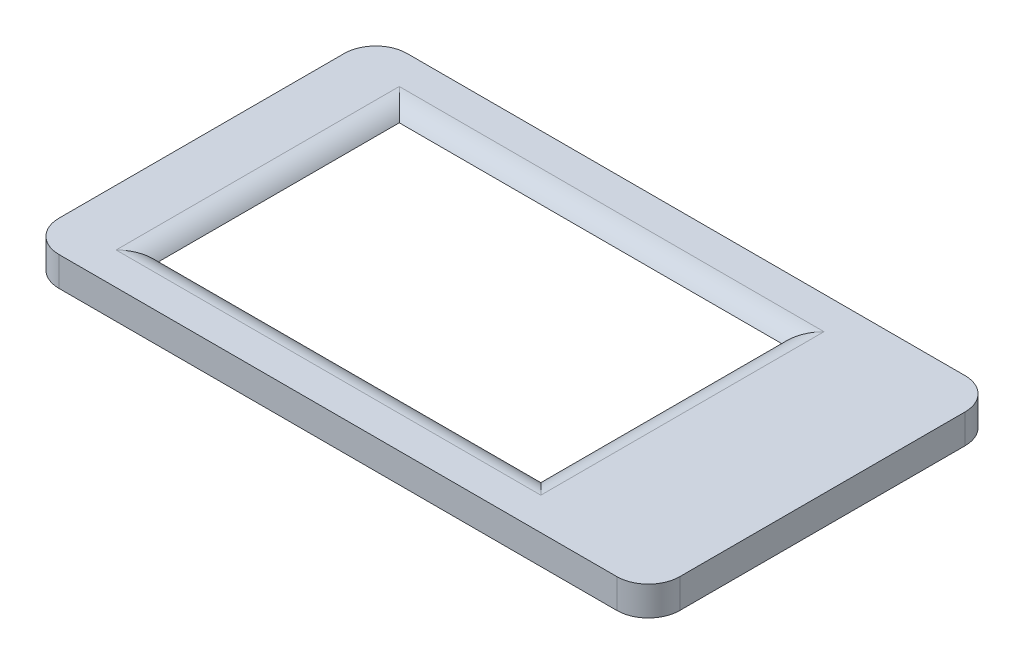
ISO-10303-21;
HEADER;
FILE_DESCRIPTION(('STEP AP214'),'2;1');
FILE_NAME('part.step','',(''),(''),'','','');
FILE_SCHEMA(('AUTOMOTIVE_DESIGN { 1 0 10303 214 1 1 1 1 }'));
ENDSEC;
DATA;
#1=APPLICATION_CONTEXT('core data for automotive mechanical design processes');
#2=APPLICATION_PROTOCOL_DEFINITION('international standard','automotive_design',2000,#1);
#3=PRODUCT_CONTEXT('',#1,'mechanical');
#4=PRODUCT('Part','Part','',(#3));
#5=PRODUCT_RELATED_PRODUCT_CATEGORY('part','',(#4));
#6=PRODUCT_DEFINITION_FORMATION('','',#4);
#7=PRODUCT_DEFINITION_CONTEXT('part definition',#1,'design');
#8=PRODUCT_DEFINITION('design','',#6,#7);
#9=PRODUCT_DEFINITION_SHAPE('','',#8);
#10=(LENGTH_UNIT() NAMED_UNIT(*) SI_UNIT(.MILLI.,.METRE.));
#11=(NAMED_UNIT(*) PLANE_ANGLE_UNIT() SI_UNIT($,.RADIAN.));
#12=(NAMED_UNIT(*) SI_UNIT($,.STERADIAN.) SOLID_ANGLE_UNIT());
#13=UNCERTAINTY_MEASURE_WITH_UNIT(LENGTH_MEASURE(1.E-05),#10,'distance_accuracy_value','');
#14=(GEOMETRIC_REPRESENTATION_CONTEXT(3) GLOBAL_UNCERTAINTY_ASSIGNED_CONTEXT((#13)) GLOBAL_UNIT_ASSIGNED_CONTEXT((#10,
#11,#12)) REPRESENTATION_CONTEXT('',''));
#15=CARTESIAN_POINT('',(0.,0.,0.));
#16=DIRECTION('',(0.,0.,1.));
#17=DIRECTION('',(1.,0.,0.));
#18=AXIS2_PLACEMENT_3D('',#15,#16,#17);
#19=CARTESIAN_POINT('',(-61.2000000000002,5.59999999999976,-33.2000000000002));
#20=DIRECTION('',(1.,0.,0.));
#21=DIRECTION('',(0.,0.,-1.));
#22=AXIS2_PLACEMENT_3D('',#19,#20,#21);
#23=PLANE('',#22);
#24=DIRECTION('',(0.,0.,1.));
#25=VECTOR('',#24,1.);
#26=CARTESIAN_POINT('',(-61.2000000000004,0.,-33.2000000000002));
#27=LINE('',#26,#25);
#28=CARTESIAN_POINT('',(-61.2000000000002,0.,-27.2000000000002));
#29=VERTEX_POINT('',#28);
#30=CARTESIAN_POINT('',(-61.2000000000001,0.,27.2));
#31=VERTEX_POINT('',#30);
#32=EDGE_CURVE('E327',#29,#31,#27,.T.);
#33=ORIENTED_EDGE('',*,*,#32,.T.);
#34=DIRECTION('',(0.,-1.00000000000001,0.));
#35=VECTOR('',#34,1.);
#36=CARTESIAN_POINT('',(-61.2000000000001,5.59999999999999,27.2));
#37=LINE('',#36,#35);
#38=CARTESIAN_POINT('',(-61.2000000000001,5.59999999999999,27.2));
#39=VERTEX_POINT('',#38);
#40=EDGE_CURVE('E212',#31,#39,#37,.F.);
#41=ORIENTED_EDGE('',*,*,#40,.T.);
#42=DIRECTION('',(0.,0.,1.));
#43=VECTOR('',#42,1.);
#44=CARTESIAN_POINT('',(-61.2000000000002,5.59999999999976,-33.2000000000002));
#45=LINE('',#44,#43);
#46=CARTESIAN_POINT('',(-61.2000000000001,5.59999999999999,-27.2000000000002));
#47=VERTEX_POINT('',#46);
#48=EDGE_CURVE('E249',#47,#39,#45,.T.);
#49=ORIENTED_EDGE('',*,*,#48,.F.);
#50=DIRECTION('',(0.,-1.00000000000001,0.));
#51=VECTOR('',#50,1.);
#52=CARTESIAN_POINT('',(-61.2000000000001,5.59999999999999,-27.2000000000002));
#53=LINE('',#52,#51);
#54=EDGE_CURVE('E209',#47,#29,#53,.T.);
#55=ORIENTED_EDGE('',*,*,#54,.T.);
#56=EDGE_LOOP('',(#33,#41,#49,#55));
#57=FACE_BOUND('',#56,.T.);
#58=ADVANCED_FACE('F48',(#57),#23,.F.);
#59=CARTESIAN_POINT('',(-61.2000000000001,5.59999999999998,33.2));
#60=DIRECTION('',(0.,0.,-1.));
#61=DIRECTION('',(-1.,0.,0.));
#62=AXIS2_PLACEMENT_3D('',#59,#60,#61);
#63=PLANE('',#62);
#64=DIRECTION('',(1.,0.,0.));
#65=VECTOR('',#64,1.);
#66=CARTESIAN_POINT('',(-61.2000000000001,5.59999999999998,33.2));
#67=LINE('',#66,#65);
#68=CARTESIAN_POINT('',(-55.2000000000001,5.59999999999977,33.2));
#69=VERTEX_POINT('',#68);
#70=CARTESIAN_POINT('',(51.2000000000002,5.59999999999977,33.2));
#71=VERTEX_POINT('',#70);
#72=EDGE_CURVE('E239',#69,#71,#67,.T.);
#73=ORIENTED_EDGE('',*,*,#72,.F.);
#74=DIRECTION('',(0.,-1.00000000000001,0.));
#75=VECTOR('',#74,1.);
#76=CARTESIAN_POINT('',(-55.2000000000001,5.59999999999977,33.2));
#77=LINE('',#76,#75);
#78=CARTESIAN_POINT('',(-55.2000000000002,0.,33.2));
#79=VERTEX_POINT('',#78);
#80=EDGE_CURVE('E197',#69,#79,#77,.T.);
#81=ORIENTED_EDGE('',*,*,#80,.T.);
#82=DIRECTION('',(1.,0.,0.));
#83=VECTOR('',#82,1.);
#84=CARTESIAN_POINT('',(-61.2000000000001,0.,33.2));
#85=LINE('',#84,#83);
#86=CARTESIAN_POINT('',(51.2000000000002,0.,33.2));
#87=VERTEX_POINT('',#86);
#88=EDGE_CURVE('E252',#79,#87,#85,.T.);
#89=ORIENTED_EDGE('',*,*,#88,.T.);
#90=DIRECTION('',(0.,-1.00000000000001,0.));
#91=VECTOR('',#90,1.);
#92=CARTESIAN_POINT('',(51.2000000000002,5.59999999999977,33.2));
#93=LINE('',#92,#91);
#94=EDGE_CURVE('E195',#87,#71,#93,.F.);
#95=ORIENTED_EDGE('',*,*,#94,.T.);
#96=EDGE_LOOP('',(#73,#81,#89,#95));
#97=FACE_BOUND('',#96,.T.);
#98=ADVANCED_FACE('F337',(#97),#63,.F.);
#99=CARTESIAN_POINT('',(57.2,5.59999999999999,-33.2));
#100=DIRECTION('',(-1.,0.,0.));
#101=DIRECTION('',(0.,0.,1.));
#102=AXIS2_PLACEMENT_3D('',#99,#100,#101);
#103=PLANE('',#102);
#104=DIRECTION('',(0.,0.,-1.));
#105=VECTOR('',#104,1.);
#106=CARTESIAN_POINT('',(57.2,5.59999999999999,-33.2));
#107=LINE('',#106,#105);
#108=CARTESIAN_POINT('',(57.2,5.59999999999977,27.2));
#109=VERTEX_POINT('',#108);
#110=CARTESIAN_POINT('',(57.2,5.59999999999977,-27.2));
#111=VERTEX_POINT('',#110);
#112=EDGE_CURVE('E229',#109,#111,#107,.T.);
#113=ORIENTED_EDGE('',*,*,#112,.F.);
#114=DIRECTION('',(0.,-1.00000000000001,0.));
#115=VECTOR('',#114,1.);
#116=CARTESIAN_POINT('',(57.2,5.59999999999977,27.2));
#117=LINE('',#116,#115);
#118=CARTESIAN_POINT('',(57.2,-2.35922392732846E-13,27.2));
#119=VERTEX_POINT('',#118);
#120=EDGE_CURVE('E13',#109,#119,#117,.T.);
#121=ORIENTED_EDGE('',*,*,#120,.T.);
#122=DIRECTION('',(0.,0.,-1.));
#123=VECTOR('',#122,1.);
#124=CARTESIAN_POINT('',(57.2,-2.35922392732846E-13,-33.2));
#125=LINE('',#124,#123);
#126=CARTESIAN_POINT('',(57.2,-2.35922392732846E-13,-27.2));
#127=VERTEX_POINT('',#126);
#128=EDGE_CURVE('E232',#119,#127,#125,.T.);
#129=ORIENTED_EDGE('',*,*,#128,.T.);
#130=DIRECTION('',(0.,-1.00000000000001,0.));
#131=VECTOR('',#130,1.);
#132=CARTESIAN_POINT('',(57.2,5.59999999999977,-27.2));
#133=LINE('',#132,#131);
#134=EDGE_CURVE('E56',#127,#111,#133,.F.);
#135=ORIENTED_EDGE('',*,*,#134,.T.);
#136=EDGE_LOOP('',(#113,#121,#129,#135));
#137=FACE_BOUND('',#136,.T.);
#138=ADVANCED_FACE('F228',(#137),#103,.F.);
#139=CARTESIAN_POINT('',(-61.2000000000002,5.59999999999976,-33.2000000000002));
#140=DIRECTION('',(0.,0.,1.));
#141=DIRECTION('',(1.,0.,0.));
#142=AXIS2_PLACEMENT_3D('',#139,#140,#141);
#143=PLANE('',#142);
#144=DIRECTION('',(-1.,0.,0.));
#145=VECTOR('',#144,1.);
#146=CARTESIAN_POINT('',(-61.2000000000004,0.,-33.2000000000002));
#147=LINE('',#146,#145);
#148=CARTESIAN_POINT('',(51.2,-2.35922392732846E-13,-33.2000000000002));
#149=VERTEX_POINT('',#148);
#150=CARTESIAN_POINT('',(-55.2000000000004,0.,-33.2000000000002));
#151=VERTEX_POINT('',#150);
#152=EDGE_CURVE('E244',#149,#151,#147,.T.);
#153=ORIENTED_EDGE('',*,*,#152,.T.);
#154=DIRECTION('',(0.,-1.00000000000001,0.));
#155=VECTOR('',#154,1.);
#156=CARTESIAN_POINT('',(-55.2000000000004,5.59999999999999,-33.2000000000005));
#157=LINE('',#156,#155);
#158=CARTESIAN_POINT('',(-55.2000000000004,5.59999999999999,-33.2000000000005));
#159=VERTEX_POINT('',#158);
#160=EDGE_CURVE('E63',#151,#159,#157,.F.);
#161=ORIENTED_EDGE('',*,*,#160,.T.);
#162=DIRECTION('',(-1.,0.,0.));
#163=VECTOR('',#162,1.);
#164=CARTESIAN_POINT('',(-61.2000000000002,5.59999999999976,-33.2000000000002));
#165=LINE('',#164,#163);
#166=CARTESIAN_POINT('',(51.2000000000002,5.59999999999999,-33.2000000000002));
#167=VERTEX_POINT('',#166);
#168=EDGE_CURVE('E238',#167,#159,#165,.T.);
#169=ORIENTED_EDGE('',*,*,#168,.F.);
#170=DIRECTION('',(0.,-1.00000000000001,0.));
#171=VECTOR('',#170,1.);
#172=CARTESIAN_POINT('',(51.2000000000002,5.59999999999999,-33.2000000000002));
#173=LINE('',#172,#171);
#174=EDGE_CURVE('E221',#167,#149,#173,.T.);
#175=ORIENTED_EDGE('',*,*,#174,.T.);
#176=EDGE_LOOP('',(#153,#161,#169,#175));
#177=FACE_BOUND('',#176,.T.);
#178=ADVANCED_FACE('F243',(#177),#143,.F.);
#179=CARTESIAN_POINT('',(0.,5.59999999999976,0.));
#180=DIRECTION('',(0.,1.00000000000001,0.));
#181=DIRECTION('',(0.,0.,1.));
#182=AXIS2_PLACEMENT_3D('',#179,#180,#181);
#183=PLANE('',#182);
#184=DIRECTION('',(-1.,0.,0.));
#185=VECTOR('',#184,1.);
#186=CARTESIAN_POINT('',(-46.5,5.59999999999976,27.));
#187=LINE('',#186,#185);
#188=CARTESIAN_POINT('',(30.5000000000001,5.59999999999999,27.));
#189=VERTEX_POINT('',#188);
#190=CARTESIAN_POINT('',(-50.5,5.59999999999999,27.));
#191=VERTEX_POINT('',#190);
#192=EDGE_CURVE('E187',#189,#191,#187,.T.);
#193=ORIENTED_EDGE('',*,*,#192,.T.);
#194=DIRECTION('',(0.,0.,-1.));
#195=VECTOR('',#194,1.);
#196=CARTESIAN_POINT('',(-50.5000000000002,5.59999999999999,-23.0000000000002));
#197=LINE('',#196,#195);
#198=CARTESIAN_POINT('',(-50.5000000000001,5.59999999999977,-27.0000000000002));
#199=VERTEX_POINT('',#198);
#200=EDGE_CURVE('E198',#191,#199,#197,.T.);
#201=ORIENTED_EDGE('',*,*,#200,.T.);
#202=DIRECTION('',(1.,0.,0.));
#203=VECTOR('',#202,1.);
#204=CARTESIAN_POINT('',(26.5000000000001,5.59999999999977,-27.0000000000002));
#205=LINE('',#204,#203);
#206=CARTESIAN_POINT('',(30.5000000000001,5.59999999999998,-27.));
#207=VERTEX_POINT('',#206);
#208=EDGE_CURVE('E258',#199,#207,#205,.T.);
#209=ORIENTED_EDGE('',*,*,#208,.T.);
#210=DIRECTION('',(0.,0.,1.));
#211=VECTOR('',#210,1.);
#212=CARTESIAN_POINT('',(30.5000000000002,5.59999999999976,23.));
#213=LINE('',#212,#211);
#214=EDGE_CURVE('E256',#207,#189,#213,.T.);
#215=ORIENTED_EDGE('',*,*,#214,.T.);
#216=EDGE_LOOP('',(#193,#201,#209,#215));
#217=FACE_BOUND('',#216,.T.);
#218=ORIENTED_EDGE('',*,*,#48,.T.);
#219=CARTESIAN_POINT('',(-55.2000000000001,5.59999999999999,27.2));
#220=DIRECTION('',(0.,1.00000000000001,0.));
#221=DIRECTION('',(0.,0.,1.));
#222=AXIS2_PLACEMENT_3D('',#219,#220,#221);
#223=CIRCLE('',#222,6.);
#224=EDGE_CURVE('E219',#39,#69,#223,.T.);
#225=ORIENTED_EDGE('',*,*,#224,.T.);
#226=ORIENTED_EDGE('',*,*,#72,.T.);
#227=CARTESIAN_POINT('',(51.2,5.59999999999999,27.2));
#228=DIRECTION('',(0.,1.00000000000001,0.));
#229=DIRECTION('',(0.,0.,1.));
#230=AXIS2_PLACEMENT_3D('',#227,#228,#229);
#231=CIRCLE('',#230,6.);
#232=EDGE_CURVE('E215',#71,#109,#231,.T.);
#233=ORIENTED_EDGE('',*,*,#232,.T.);
#234=ORIENTED_EDGE('',*,*,#112,.T.);
#235=CARTESIAN_POINT('',(51.2,5.59999999999977,-27.2));
#236=DIRECTION('',(0.,1.00000000000001,0.));
#237=DIRECTION('',(0.,0.,1.));
#238=AXIS2_PLACEMENT_3D('',#235,#236,#237);
#239=CIRCLE('',#238,6.);
#240=EDGE_CURVE('E70',#111,#167,#239,.T.);
#241=ORIENTED_EDGE('',*,*,#240,.T.);
#242=ORIENTED_EDGE('',*,*,#168,.T.);
#243=CARTESIAN_POINT('',(-55.2000000000002,5.59999999999977,-27.2000000000002));
#244=DIRECTION('',(0.,1.00000000000001,0.));
#245=DIRECTION('',(0.,0.,1.));
#246=AXIS2_PLACEMENT_3D('',#243,#244,#245);
#247=CIRCLE('',#246,6.);
#248=EDGE_CURVE('E217',#159,#47,#247,.T.);
#249=ORIENTED_EDGE('',*,*,#248,.T.);
#250=EDGE_LOOP('',(#218,#225,#226,#233,#234,#241,#242,#249));
#251=FACE_BOUND('',#250,.T.);
#252=ADVANCED_FACE('F235',(#217,#251),#183,.T.);
#253=CARTESIAN_POINT('',(0.,0.,0.));
#254=DIRECTION('',(0.,1.00000000000001,0.));
#255=DIRECTION('',(0.,0.,1.));
#256=AXIS2_PLACEMENT_3D('',#253,#254,#255);
#257=PLANE('',#256);
#258=DIRECTION('',(1.,0.,0.));
#259=VECTOR('',#258,1.);
#260=CARTESIAN_POINT('',(32.5000000000001,-2.35922392732846E-13,-29.0000000000002));
#261=LINE('',#260,#259);
#262=CARTESIAN_POINT('',(-52.5000000000002,0.,-29.));
#263=VERTEX_POINT('',#262);
#264=CARTESIAN_POINT('',(32.5000000000001,-2.35922392732846E-13,-29.0000000000002));
#265=VERTEX_POINT('',#264);
#266=EDGE_CURVE('E289',#263,#265,#261,.T.);
#267=ORIENTED_EDGE('',*,*,#266,.F.);
#268=DIRECTION('',(0.,0.,-1.));
#269=VECTOR('',#268,1.);
#270=CARTESIAN_POINT('',(-52.5000000000002,0.,-29.));
#271=LINE('',#270,#269);
#272=CARTESIAN_POINT('',(-52.5000000000002,0.,29.));
#273=VERTEX_POINT('',#272);
#274=EDGE_CURVE('E273',#273,#263,#271,.T.);
#275=ORIENTED_EDGE('',*,*,#274,.F.);
#276=DIRECTION('',(-1.,0.,0.));
#277=VECTOR('',#276,1.);
#278=CARTESIAN_POINT('',(32.5,-2.35922392732846E-13,29.));
#279=LINE('',#278,#277);
#280=CARTESIAN_POINT('',(32.5,-2.35922392732846E-13,29.));
#281=VERTEX_POINT('',#280);
#282=EDGE_CURVE('E278',#281,#273,#279,.T.);
#283=ORIENTED_EDGE('',*,*,#282,.F.);
#284=DIRECTION('',(0.,0.,1.));
#285=VECTOR('',#284,1.);
#286=CARTESIAN_POINT('',(32.5000000000001,-2.35922392732846E-13,-29.0000000000002));
#287=LINE('',#286,#285);
#288=EDGE_CURVE('E292',#265,#281,#287,.T.);
#289=ORIENTED_EDGE('',*,*,#288,.F.);
#290=EDGE_LOOP('',(#267,#275,#283,#289));
#291=FACE_BOUND('',#290,.T.);
#292=CARTESIAN_POINT('',(35.9600000000001,-2.35922392732846E-13,-18.7000000000002));
#293=DIRECTION('',(0.,-1.00000000000001,0.));
#294=DIRECTION('',(0.,0.,1.));
#295=AXIS2_PLACEMENT_3D('',#292,#293,#294);
#296=CIRCLE('',#295,3.);
#297=CARTESIAN_POINT('',(35.9600000000001,-2.35922423136696E-13,-15.7000000000002));
#298=VERTEX_POINT('',#297);
#299=EDGE_CURVE('E299',#298,#298,#296,.T.);
#300=ORIENTED_EDGE('',*,*,#299,.F.);
#301=EDGE_LOOP('',(#300));
#302=FACE_BOUND('',#301,.T.);
#303=CARTESIAN_POINT('',(35.9600000000002,-4.71844785465692E-13,22.3));
#304=DIRECTION('',(0.,-1.00000000000001,0.));
#305=DIRECTION('',(0.,0.,-1.));
#306=AXIS2_PLACEMENT_3D('',#303,#304,#305);
#307=CIRCLE('',#306,3.);
#308=CARTESIAN_POINT('',(35.9600000000002,-4.71844755061841E-13,19.3));
#309=VERTEX_POINT('',#308);
#310=EDGE_CURVE('E309',#309,#309,#307,.T.);
#311=ORIENTED_EDGE('',*,*,#310,.F.);
#312=EDGE_LOOP('',(#311));
#313=FACE_BOUND('',#312,.T.);
#314=CARTESIAN_POINT('',(-56.16,0.,-21.9));
#315=DIRECTION('',(0.,-1.00000000000001,0.));
#316=DIRECTION('',(0.,0.,1.));
#317=AXIS2_PLACEMENT_3D('',#314,#315,#316);
#318=CIRCLE('',#317,3.);
#319=CARTESIAN_POINT('',(-56.16,0.,-18.9));
#320=VERTEX_POINT('',#319);
#321=EDGE_CURVE('E315',#320,#320,#318,.T.);
#322=ORIENTED_EDGE('',*,*,#321,.F.);
#323=EDGE_LOOP('',(#322));
#324=FACE_BOUND('',#323,.T.);
#325=CARTESIAN_POINT('',(-56.1600000000001,0.,21.1));
#326=DIRECTION('',(0.,-1.00000000000001,0.));
#327=DIRECTION('',(0.,0.,-1.));
#328=AXIS2_PLACEMENT_3D('',#325,#326,#327);
#329=CIRCLE('',#328,3.);
#330=CARTESIAN_POINT('',(-56.1600000000001,0.,18.1));
#331=VERTEX_POINT('',#330);
#332=EDGE_CURVE('E321',#331,#331,#329,.T.);
#333=ORIENTED_EDGE('',*,*,#332,.F.);
#334=EDGE_LOOP('',(#333));
#335=FACE_BOUND('',#334,.T.);
#336=ORIENTED_EDGE('',*,*,#88,.F.);
#337=CARTESIAN_POINT('',(-55.2000000000002,-2.35922392732846E-13,27.2));
#338=DIRECTION('',(0.,1.00000000000001,0.));
#339=DIRECTION('',(0.,0.,1.));
#340=AXIS2_PLACEMENT_3D('',#337,#338,#339);
#341=CIRCLE('',#340,6.);
#342=EDGE_CURVE('E207',#79,#31,#341,.F.);
#343=ORIENTED_EDGE('',*,*,#342,.T.);
#344=ORIENTED_EDGE('',*,*,#32,.F.);
#345=CARTESIAN_POINT('',(-55.2000000000002,0.,-27.2000000000002));
#346=DIRECTION('',(0.,1.00000000000001,0.));
#347=DIRECTION('',(0.,0.,1.));
#348=AXIS2_PLACEMENT_3D('',#345,#346,#347);
#349=CIRCLE('',#348,6.);
#350=EDGE_CURVE('E205',#29,#151,#349,.F.);
#351=ORIENTED_EDGE('',*,*,#350,.T.);
#352=ORIENTED_EDGE('',*,*,#152,.F.);
#353=CARTESIAN_POINT('',(51.2,-2.35922392732846E-13,-27.2000000000002));
#354=DIRECTION('',(0.,1.00000000000001,0.));
#355=DIRECTION('',(0.,0.,1.));
#356=AXIS2_PLACEMENT_3D('',#353,#354,#355);
#357=CIRCLE('',#356,6.);
#358=EDGE_CURVE('E201',#149,#127,#357,.F.);
#359=ORIENTED_EDGE('',*,*,#358,.T.);
#360=ORIENTED_EDGE('',*,*,#128,.F.);
#361=CARTESIAN_POINT('',(51.2,-2.35922392732846E-13,27.2000000000005));
#362=DIRECTION('',(0.,1.00000000000001,0.));
#363=DIRECTION('',(0.,0.,1.));
#364=AXIS2_PLACEMENT_3D('',#361,#362,#363);
#365=CIRCLE('',#364,6.);
#366=EDGE_CURVE('E203',#119,#87,#365,.F.);
#367=ORIENTED_EDGE('',*,*,#366,.T.);
#368=EDGE_LOOP('',(#336,#343,#344,#351,#352,#359,#360,#367));
#369=FACE_BOUND('',#368,.T.);
#370=ADVANCED_FACE('F247',(#291,#302,#313,#324,#335,#369),#257,.F.);
#371=CARTESIAN_POINT('',(-56.1600000000001,2.99999999999999,21.1));
#372=DIRECTION('',(0.,-1.00000000000001,0.));
#373=DIRECTION('',(0.,0.,-1.));
#374=AXIS2_PLACEMENT_3D('',#371,#372,#373);
#375=CYLINDRICAL_SURFACE('',#374,3.);
#376=CARTESIAN_POINT('',(-56.1600000000001,2.99999999999999,21.1));
#377=DIRECTION('',(0.,-1.00000000000001,0.));
#378=DIRECTION('',(0.,0.,-1.));
#379=AXIS2_PLACEMENT_3D('',#376,#377,#378);
#380=CIRCLE('',#379,3.);
#381=CARTESIAN_POINT('',(-56.1600000000001,2.99999999999999,18.1));
#382=VERTEX_POINT('',#381);
#383=EDGE_CURVE('E324',#382,#382,#380,.T.);
#384=ORIENTED_EDGE('',*,*,#383,.F.);
#385=EDGE_LOOP('',(#384));
#386=FACE_BOUND('',#385,.T.);
#387=ORIENTED_EDGE('',*,*,#332,.T.);
#388=EDGE_LOOP('',(#387));
#389=FACE_BOUND('',#388,.T.);
#390=ADVANCED_FACE('F495',(#386,#389),#375,.F.);
#391=CARTESIAN_POINT('',(-56.1600000000001,2.99999999999999,21.1));
#392=DIRECTION('',(0.,-1.00000000000001,0.));
#393=DIRECTION('',(0.,0.,-1.));
#394=AXIS2_PLACEMENT_3D('',#391,#392,#393);
#395=PLANE('',#394);
#396=ORIENTED_EDGE('',*,*,#383,.T.);
#397=EDGE_LOOP('',(#396));
#398=FACE_BOUND('',#397,.T.);
#399=ADVANCED_FACE('F487',(#398),#395,.T.);
#400=CARTESIAN_POINT('',(-56.1600000000001,2.99999999999977,-21.9000000000002));
#401=DIRECTION('',(0.,-1.00000000000001,0.));
#402=DIRECTION('',(0.,0.,-1.));
#403=AXIS2_PLACEMENT_3D('',#400,#401,#402);
#404=CYLINDRICAL_SURFACE('',#403,3.);
#405=CARTESIAN_POINT('',(-56.1600000000001,2.99999999999977,-21.9000000000002));
#406=DIRECTION('',(0.,-1.00000000000001,0.));
#407=DIRECTION('',(0.,0.,1.));
#408=AXIS2_PLACEMENT_3D('',#405,#406,#407);
#409=CIRCLE('',#408,3.);
#410=CARTESIAN_POINT('',(-56.1600000000001,2.99999999999977,-18.9000000000002));
#411=VERTEX_POINT('',#410);
#412=EDGE_CURVE('E318',#411,#411,#409,.T.);
#413=ORIENTED_EDGE('',*,*,#412,.F.);
#414=EDGE_LOOP('',(#413));
#415=FACE_BOUND('',#414,.T.);
#416=ORIENTED_EDGE('',*,*,#321,.T.);
#417=EDGE_LOOP('',(#416));
#418=FACE_BOUND('',#417,.T.);
#419=ADVANCED_FACE('F479',(#415,#418),#404,.F.);
#420=CARTESIAN_POINT('',(-56.1600000000001,2.99999999999977,-21.9000000000002));
#421=DIRECTION('',(0.,1.00000000000001,0.));
#422=DIRECTION('',(0.,0.,1.));
#423=AXIS2_PLACEMENT_3D('',#420,#421,#422);
#424=PLANE('',#423);
#425=ORIENTED_EDGE('',*,*,#412,.T.);
#426=EDGE_LOOP('',(#425));
#427=FACE_BOUND('',#426,.T.);
#428=ADVANCED_FACE('F471',(#427),#424,.F.);
#429=CARTESIAN_POINT('',(35.9600000000001,2.99999999999977,22.3));
#430=DIRECTION('',(0.,-1.00000000000001,0.));
#431=DIRECTION('',(0.,0.,-1.));
#432=AXIS2_PLACEMENT_3D('',#429,#430,#431);
#433=CYLINDRICAL_SURFACE('',#432,3.);
#434=CARTESIAN_POINT('',(35.9600000000001,2.99999999999977,22.3));
#435=DIRECTION('',(0.,-1.00000000000001,0.));
#436=DIRECTION('',(0.,0.,-1.));
#437=AXIS2_PLACEMENT_3D('',#434,#435,#436);
#438=CIRCLE('',#437,3.);
#439=CARTESIAN_POINT('',(35.9600000000001,2.99999999999977,19.3));
#440=VERTEX_POINT('',#439);
#441=EDGE_CURVE('E312',#440,#440,#438,.T.);
#442=ORIENTED_EDGE('',*,*,#441,.F.);
#443=EDGE_LOOP('',(#442));
#444=FACE_BOUND('',#443,.T.);
#445=ORIENTED_EDGE('',*,*,#310,.T.);
#446=EDGE_LOOP('',(#445));
#447=FACE_BOUND('',#446,.T.);
#448=ADVANCED_FACE('F463',(#444,#447),#433,.F.);
#449=CARTESIAN_POINT('',(35.9600000000001,2.99999999999977,22.3));
#450=DIRECTION('',(0.,-1.00000000000001,0.));
#451=DIRECTION('',(0.,0.,-1.));
#452=AXIS2_PLACEMENT_3D('',#449,#450,#451);
#453=PLANE('',#452);
#454=ORIENTED_EDGE('',*,*,#441,.T.);
#455=EDGE_LOOP('',(#454));
#456=FACE_BOUND('',#455,.T.);
#457=ADVANCED_FACE('F455',(#456),#453,.T.);
#458=CARTESIAN_POINT('',(35.9600000000001,2.99999999999977,-18.7));
#459=DIRECTION('',(0.,-1.00000000000001,0.));
#460=DIRECTION('',(0.,0.,-1.));
#461=AXIS2_PLACEMENT_3D('',#458,#459,#460);
#462=CYLINDRICAL_SURFACE('',#461,3.);
#463=CARTESIAN_POINT('',(35.9600000000001,2.99999999999977,-18.7));
#464=DIRECTION('',(0.,-1.00000000000001,0.));
#465=DIRECTION('',(0.,0.,1.));
#466=AXIS2_PLACEMENT_3D('',#463,#464,#465);
#467=CIRCLE('',#466,3.);
#468=CARTESIAN_POINT('',(35.9600000000001,2.99999999999977,-15.7));
#469=VERTEX_POINT('',#468);
#470=EDGE_CURVE('E306',#469,#469,#467,.T.);
#471=ORIENTED_EDGE('',*,*,#470,.F.);
#472=EDGE_LOOP('',(#471));
#473=FACE_BOUND('',#472,.T.);
#474=ORIENTED_EDGE('',*,*,#299,.T.);
#475=EDGE_LOOP('',(#474));
#476=FACE_BOUND('',#475,.T.);
#477=ADVANCED_FACE('F447',(#473,#476),#462,.F.);
#478=CARTESIAN_POINT('',(35.9600000000001,2.99999999999977,-18.7));
#479=DIRECTION('',(0.,1.00000000000001,0.));
#480=DIRECTION('',(0.,0.,1.));
#481=AXIS2_PLACEMENT_3D('',#478,#479,#480);
#482=PLANE('',#481);
#483=ORIENTED_EDGE('',*,*,#470,.T.);
#484=EDGE_LOOP('',(#483));
#485=FACE_BOUND('',#484,.T.);
#486=ADVANCED_FACE('F439',(#485),#482,.F.);
#487=CARTESIAN_POINT('',(-52.5000000000002,3.60000000000001,-29.0000000000002));
#488=DIRECTION('',(-1.,0.,0.));
#489=DIRECTION('',(0.,0.,1.));
#490=AXIS2_PLACEMENT_3D('',#487,#488,#489);
#491=PLANE('',#490);
#492=ORIENTED_EDGE('',*,*,#274,.T.);
#493=DIRECTION('',(0.,-1.00000000000001,0.));
#494=VECTOR('',#493,1.);
#495=CARTESIAN_POINT('',(-52.5000000000002,3.60000000000001,-29.0000000000002));
#496=LINE('',#495,#494);
#497=CARTESIAN_POINT('',(-52.5000000000002,3.60000000000001,-29.0000000000002));
#498=VERTEX_POINT('',#497);
#499=EDGE_CURVE('E287',#498,#263,#496,.T.);
#500=ORIENTED_EDGE('',*,*,#499,.F.);
#501=DIRECTION('',(0.,0.,-1.));
#502=VECTOR('',#501,1.);
#503=CARTESIAN_POINT('',(-52.5000000000002,3.60000000000001,-29.0000000000002));
#504=LINE('',#503,#502);
#505=CARTESIAN_POINT('',(-52.5000000000002,3.59999999999999,29.));
#506=VERTEX_POINT('',#505);
#507=EDGE_CURVE('E274',#506,#498,#504,.T.);
#508=ORIENTED_EDGE('',*,*,#507,.F.);
#509=DIRECTION('',(0.,-1.00000000000001,0.));
#510=VECTOR('',#509,1.);
#511=CARTESIAN_POINT('',(-52.5000000000002,3.59999999999999,29.));
#512=LINE('',#511,#510);
#513=EDGE_CURVE('E297',#506,#273,#512,.T.);
#514=ORIENTED_EDGE('',*,*,#513,.T.);
#515=EDGE_LOOP('',(#492,#500,#508,#514));
#516=FACE_BOUND('',#515,.T.);
#517=ADVANCED_FACE('F431',(#516),#491,.F.);
#518=CARTESIAN_POINT('',(32.5000000000001,3.59999999999999,29.));
#519=DIRECTION('',(0.,0.,1.));
#520=DIRECTION('',(1.,0.,0.));
#521=AXIS2_PLACEMENT_3D('',#518,#519,#520);
#522=PLANE('',#521);
#523=ORIENTED_EDGE('',*,*,#282,.T.);
#524=ORIENTED_EDGE('',*,*,#513,.F.);
#525=DIRECTION('',(-1.,0.,0.));
#526=VECTOR('',#525,1.);
#527=CARTESIAN_POINT('',(32.5000000000001,3.59999999999999,29.));
#528=LINE('',#527,#526);
#529=CARTESIAN_POINT('',(32.5000000000001,3.59999999999999,29.));
#530=VERTEX_POINT('',#529);
#531=EDGE_CURVE('E284',#530,#506,#528,.T.);
#532=ORIENTED_EDGE('',*,*,#531,.F.);
#533=DIRECTION('',(0.,-1.00000000000001,0.));
#534=VECTOR('',#533,1.);
#535=CARTESIAN_POINT('',(32.5000000000001,3.59999999999999,29.));
#536=LINE('',#535,#534);
#537=EDGE_CURVE('E300',#530,#281,#536,.T.);
#538=ORIENTED_EDGE('',*,*,#537,.T.);
#539=EDGE_LOOP('',(#523,#524,#532,#538));
#540=FACE_BOUND('',#539,.T.);
#541=ADVANCED_FACE('F423',(#540),#522,.F.);
#542=CARTESIAN_POINT('',(32.5000000000002,3.60000000000001,-29.));
#543=DIRECTION('',(1.,0.,0.));
#544=DIRECTION('',(0.,0.,-1.));
#545=AXIS2_PLACEMENT_3D('',#542,#543,#544);
#546=PLANE('',#545);
#547=ORIENTED_EDGE('',*,*,#288,.T.);
#548=ORIENTED_EDGE('',*,*,#537,.F.);
#549=DIRECTION('',(0.,0.,1.));
#550=VECTOR('',#549,1.);
#551=CARTESIAN_POINT('',(32.5000000000002,3.60000000000001,-29.));
#552=LINE('',#551,#550);
#553=CARTESIAN_POINT('',(32.5000000000002,3.60000000000001,-29.));
#554=VERTEX_POINT('',#553);
#555=EDGE_CURVE('E281',#554,#530,#552,.T.);
#556=ORIENTED_EDGE('',*,*,#555,.F.);
#557=DIRECTION('',(0.,-1.00000000000001,0.));
#558=VECTOR('',#557,1.);
#559=CARTESIAN_POINT('',(32.5000000000002,3.60000000000001,-29.));
#560=LINE('',#559,#558);
#561=EDGE_CURVE('E302',#554,#265,#560,.T.);
#562=ORIENTED_EDGE('',*,*,#561,.T.);
#563=EDGE_LOOP('',(#547,#548,#556,#562));
#564=FACE_BOUND('',#563,.T.);
#565=ADVANCED_FACE('F415',(#564),#546,.F.);
#566=CARTESIAN_POINT('',(32.5000000000002,3.60000000000001,-29.));
#567=DIRECTION('',(0.,0.,-1.));
#568=DIRECTION('',(-1.,0.,0.));
#569=AXIS2_PLACEMENT_3D('',#566,#567,#568);
#570=PLANE('',#569);
#571=ORIENTED_EDGE('',*,*,#266,.T.);
#572=ORIENTED_EDGE('',*,*,#561,.F.);
#573=DIRECTION('',(1.,0.,0.));
#574=VECTOR('',#573,1.);
#575=CARTESIAN_POINT('',(32.5000000000002,3.60000000000001,-29.));
#576=LINE('',#575,#574);
#577=EDGE_CURVE('E277',#498,#554,#576,.T.);
#578=ORIENTED_EDGE('',*,*,#577,.F.);
#579=ORIENTED_EDGE('',*,*,#499,.T.);
#580=EDGE_LOOP('',(#571,#572,#578,#579));
#581=FACE_BOUND('',#580,.T.);
#582=ADVANCED_FACE('F408',(#581),#570,.F.);
#583=CARTESIAN_POINT('',(0.,3.59999999999977,0.));
#584=DIRECTION('',(0.,-1.00000000000001,0.));
#585=DIRECTION('',(0.,0.,-1.));
#586=AXIS2_PLACEMENT_3D('',#583,#584,#585);
#587=PLANE('',#586);
#588=DIRECTION('',(1.,0.,0.));
#589=VECTOR('',#588,1.);
#590=CARTESIAN_POINT('',(-46.5000000000002,3.59999999999977,-23.));
#591=LINE('',#590,#589);
#592=CARTESIAN_POINT('',(-46.5000000000002,3.59999999999977,-23.));
#593=VERTEX_POINT('',#592);
#594=CARTESIAN_POINT('',(26.5,3.59999999999977,-23.0000000000002));
#595=VERTEX_POINT('',#594);
#596=EDGE_CURVE('E184',#593,#595,#591,.T.);
#597=ORIENTED_EDGE('',*,*,#596,.F.);
#598=DIRECTION('',(0.,0.,-1.));
#599=VECTOR('',#598,1.);
#600=CARTESIAN_POINT('',(-46.5,3.59999999999999,23.));
#601=LINE('',#600,#599);
#602=CARTESIAN_POINT('',(-46.5,3.59999999999999,23.));
#603=VERTEX_POINT('',#602);
#604=EDGE_CURVE('E170',#603,#593,#601,.T.);
#605=ORIENTED_EDGE('',*,*,#604,.F.);
#606=DIRECTION('',(-1.,0.,0.));
#607=VECTOR('',#606,1.);
#608=CARTESIAN_POINT('',(-46.5,3.59999999999999,23.));
#609=LINE('',#608,#607);
#610=CARTESIAN_POINT('',(26.5,3.59999999999977,23.));
#611=VERTEX_POINT('',#610);
#612=EDGE_CURVE('E163',#611,#603,#609,.T.);
#613=ORIENTED_EDGE('',*,*,#612,.F.);
#614=DIRECTION('',(0.,0.,1.));
#615=VECTOR('',#614,1.);
#616=CARTESIAN_POINT('',(26.5,3.59999999999977,23.));
#617=LINE('',#616,#615);
#618=EDGE_CURVE('E167',#595,#611,#617,.T.);
#619=ORIENTED_EDGE('',*,*,#618,.F.);
#620=EDGE_LOOP('',(#597,#605,#613,#619));
#621=FACE_BOUND('',#620,.T.);
#622=ORIENTED_EDGE('',*,*,#507,.T.);
#623=ORIENTED_EDGE('',*,*,#577,.T.);
#624=ORIENTED_EDGE('',*,*,#555,.T.);
#625=ORIENTED_EDGE('',*,*,#531,.T.);
#626=EDGE_LOOP('',(#622,#623,#624,#625));
#627=FACE_BOUND('',#626,.T.);
#628=ADVANCED_FACE('F165',(#621,#627),#587,.T.);
#629=CARTESIAN_POINT('',(30.5000000000002,0.600000000000003,23.));
#630=DIRECTION('',(0.,0.,-1.));
#631=DIRECTION('',(-1.,0.,0.));
#632=AXIS2_PLACEMENT_3D('',#629,#630,#631);
#633=CYLINDRICAL_SURFACE('',#632,5.);
#634=CARTESIAN_POINT('',(30.5000000000002,0.600000000000003,27.));
#635=DIRECTION('',(0.707106781186549,0.,-0.707106781186549));
#636=DIRECTION('',(0.707106781186549,0.,0.707106781186549));
#637=AXIS2_PLACEMENT_3D('',#634,#635,#636);
#638=ELLIPSE('',#637,7.07106781186547,5.);
#639=EDGE_CURVE('E179',#189,#611,#638,.F.);
#640=ORIENTED_EDGE('',*,*,#639,.F.);
#641=ORIENTED_EDGE('',*,*,#214,.F.);
#642=CARTESIAN_POINT('',(30.5000000000001,0.599999999999767,-27.));
#643=DIRECTION('',(-0.707106781186549,0.,-0.707106781186549));
#644=DIRECTION('',(-0.707106781186549,0.,0.707106781186549));
#645=AXIS2_PLACEMENT_3D('',#642,#643,#644);
#646=ELLIPSE('',#645,7.07106781186547,5.);
#647=EDGE_CURVE('E182',#595,#207,#646,.T.);
#648=ORIENTED_EDGE('',*,*,#647,.F.);
#649=ORIENTED_EDGE('',*,*,#618,.T.);
#650=EDGE_LOOP('',(#640,#641,#648,#649));
#651=FACE_BOUND('',#650,.T.);
#652=ADVANCED_FACE('F177',(#651),#633,.T.);
#653=CARTESIAN_POINT('',(-46.5000000000002,0.599999999999989,-27.));
#654=DIRECTION('',(-1.,0.,0.));
#655=DIRECTION('',(0.,0.,1.));
#656=AXIS2_PLACEMENT_3D('',#653,#654,#655);
#657=CYLINDRICAL_SURFACE('',#656,5.);
#658=ORIENTED_EDGE('',*,*,#647,.T.);
#659=ORIENTED_EDGE('',*,*,#208,.F.);
#660=CARTESIAN_POINT('',(-50.5000000000002,0.599999999999767,-27.0000000000002));
#661=DIRECTION('',(-0.707106781186549,0.,0.707106781186549));
#662=DIRECTION('',(0.707106781186549,0.,0.707106781186549));
#663=AXIS2_PLACEMENT_3D('',#660,#661,#662);
#664=ELLIPSE('',#663,7.07106781186547,5.);
#665=EDGE_CURVE('E188',#593,#199,#664,.T.);
#666=ORIENTED_EDGE('',*,*,#665,.F.);
#667=ORIENTED_EDGE('',*,*,#596,.T.);
#668=EDGE_LOOP('',(#658,#659,#666,#667));
#669=FACE_BOUND('',#668,.T.);
#670=ADVANCED_FACE('F269',(#669),#657,.T.);
#671=CARTESIAN_POINT('',(-46.5000000000001,0.599999999999767,27.));
#672=DIRECTION('',(1.,0.,0.));
#673=DIRECTION('',(0.,0.,-1.));
#674=AXIS2_PLACEMENT_3D('',#671,#672,#673);
#675=CYLINDRICAL_SURFACE('',#674,5.);
#676=ORIENTED_EDGE('',*,*,#639,.T.);
#677=ORIENTED_EDGE('',*,*,#612,.T.);
#678=CARTESIAN_POINT('',(-50.5000000000001,0.599999999999989,27.));
#679=DIRECTION('',(0.707106781186549,0.,0.707106781186549));
#680=DIRECTION('',(-0.707106781186549,0.,0.707106781186549));
#681=AXIS2_PLACEMENT_3D('',#678,#679,#680);
#682=ELLIPSE('',#681,7.07106781186547,5.);
#683=EDGE_CURVE('E191',#191,#603,#682,.F.);
#684=ORIENTED_EDGE('',*,*,#683,.F.);
#685=ORIENTED_EDGE('',*,*,#192,.F.);
#686=EDGE_LOOP('',(#676,#677,#684,#685));
#687=FACE_BOUND('',#686,.T.);
#688=ADVANCED_FACE('F186',(#687),#675,.T.);
#689=CARTESIAN_POINT('',(-50.5000000000002,0.599999999999989,23.));
#690=DIRECTION('',(0.,0.,1.));
#691=DIRECTION('',(1.,0.,0.));
#692=AXIS2_PLACEMENT_3D('',#689,#690,#691);
#693=CYLINDRICAL_SURFACE('',#692,5.);
#694=ORIENTED_EDGE('',*,*,#665,.T.);
#695=ORIENTED_EDGE('',*,*,#200,.F.);
#696=ORIENTED_EDGE('',*,*,#683,.T.);
#697=ORIENTED_EDGE('',*,*,#604,.T.);
#698=EDGE_LOOP('',(#694,#695,#696,#697));
#699=FACE_BOUND('',#698,.T.);
#700=ADVANCED_FACE('F264',(#699),#693,.T.);
#701=CARTESIAN_POINT('',(-55.2000000000001,5.59999999999999,27.2));
#702=DIRECTION('',(0.,-1.00000000000001,0.));
#703=DIRECTION('',(0.,0.,-1.));
#704=AXIS2_PLACEMENT_3D('',#701,#702,#703);
#705=CYLINDRICAL_SURFACE('',#704,6.);
#706=ORIENTED_EDGE('',*,*,#224,.F.);
#707=ORIENTED_EDGE('',*,*,#40,.F.);
#708=ORIENTED_EDGE('',*,*,#342,.F.);
#709=ORIENTED_EDGE('',*,*,#80,.F.);
#710=EDGE_LOOP('',(#706,#707,#708,#709));
#711=FACE_BOUND('',#710,.T.);
#712=ADVANCED_FACE('F347',(#711),#705,.T.);
#713=CARTESIAN_POINT('',(-55.2000000000002,5.59999999999977,-27.2000000000002));
#714=DIRECTION('',(0.,-1.00000000000001,0.));
#715=DIRECTION('',(0.,0.,-1.));
#716=AXIS2_PLACEMENT_3D('',#713,#714,#715);
#717=CYLINDRICAL_SURFACE('',#716,6.);
#718=ORIENTED_EDGE('',*,*,#248,.F.);
#719=ORIENTED_EDGE('',*,*,#160,.F.);
#720=ORIENTED_EDGE('',*,*,#350,.F.);
#721=ORIENTED_EDGE('',*,*,#54,.F.);
#722=EDGE_LOOP('',(#718,#719,#720,#721));
#723=FACE_BOUND('',#722,.T.);
#724=ADVANCED_FACE('F342',(#723),#717,.T.);
#725=CARTESIAN_POINT('',(51.2,5.59999999999999,27.2));
#726=DIRECTION('',(0.,-1.00000000000001,0.));
#727=DIRECTION('',(0.,0.,-1.));
#728=AXIS2_PLACEMENT_3D('',#725,#726,#727);
#729=CYLINDRICAL_SURFACE('',#728,6.);
#730=ORIENTED_EDGE('',*,*,#232,.F.);
#731=ORIENTED_EDGE('',*,*,#94,.F.);
#732=ORIENTED_EDGE('',*,*,#366,.F.);
#733=ORIENTED_EDGE('',*,*,#120,.F.);
#734=EDGE_LOOP('',(#730,#731,#732,#733));
#735=FACE_BOUND('',#734,.T.);
#736=ADVANCED_FACE('F340',(#735),#729,.T.);
#737=CARTESIAN_POINT('',(51.2,5.59999999999977,-27.2));
#738=DIRECTION('',(0.,-1.00000000000001,0.));
#739=DIRECTION('',(0.,0.,-1.));
#740=AXIS2_PLACEMENT_3D('',#737,#738,#739);
#741=CYLINDRICAL_SURFACE('',#740,6.);
#742=ORIENTED_EDGE('',*,*,#240,.F.);
#743=ORIENTED_EDGE('',*,*,#134,.F.);
#744=ORIENTED_EDGE('',*,*,#358,.F.);
#745=ORIENTED_EDGE('',*,*,#174,.F.);
#746=EDGE_LOOP('',(#742,#743,#744,#745));
#747=FACE_BOUND('',#746,.T.);
#748=ADVANCED_FACE('F50',(#747),#741,.T.);
#749=CLOSED_SHELL('',(#58,#98,#138,#178,#252,#370,#390,#399,#419,#428,#448,#457,#477,#486,#517,
#541,#565,#582,#628,#652,#670,#688,#700,#712,#724,#736,#748));
#750=MANIFOLD_SOLID_BREP('B2',#749);
#751=ADVANCED_BREP_SHAPE_REPRESENTATION('',(#18,#750),#14);
#752=SHAPE_DEFINITION_REPRESENTATION(#9,#751);
ENDSEC;
END-ISO-10303-21;
